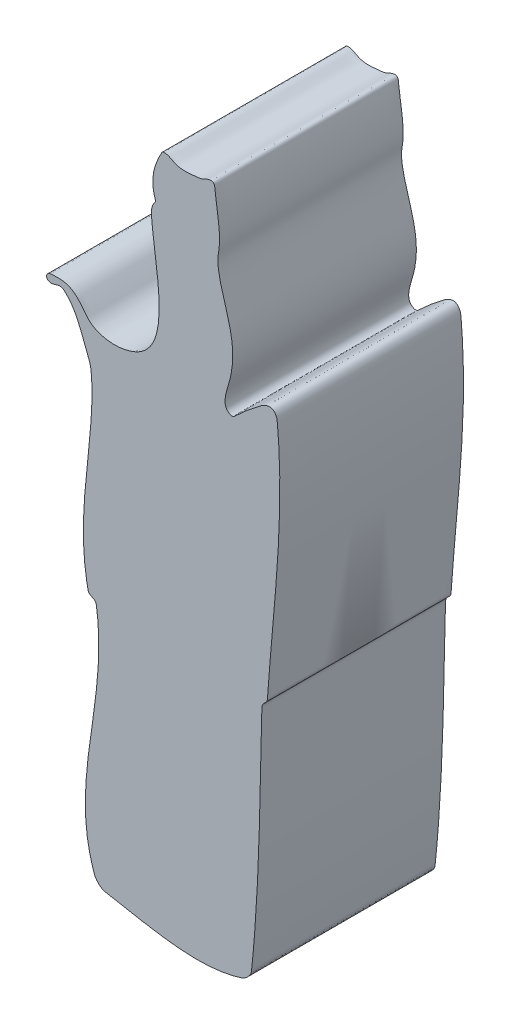
ISO-10303-21;
HEADER;
FILE_DESCRIPTION(('STEP AP214'),'2;1');
FILE_NAME('part.step','',(''),(''),'','','');
FILE_SCHEMA(('AUTOMOTIVE_DESIGN { 1 0 10303 214 1 1 1 1 }'));
ENDSEC;
DATA;
#1=APPLICATION_CONTEXT('core data for automotive mechanical design processes');
#2=APPLICATION_PROTOCOL_DEFINITION('international standard','automotive_design',2000,#1);
#3=PRODUCT_CONTEXT('',#1,'mechanical');
#4=PRODUCT('Part','Part','',(#3));
#5=PRODUCT_RELATED_PRODUCT_CATEGORY('part','',(#4));
#6=PRODUCT_DEFINITION_FORMATION('','',#4);
#7=PRODUCT_DEFINITION_CONTEXT('part definition',#1,'design');
#8=PRODUCT_DEFINITION('design','',#6,#7);
#9=PRODUCT_DEFINITION_SHAPE('','',#8);
#10=(LENGTH_UNIT() NAMED_UNIT(*) SI_UNIT(.MILLI.,.METRE.));
#11=(NAMED_UNIT(*) PLANE_ANGLE_UNIT() SI_UNIT($,.RADIAN.));
#12=(NAMED_UNIT(*) SI_UNIT($,.STERADIAN.) SOLID_ANGLE_UNIT());
#13=UNCERTAINTY_MEASURE_WITH_UNIT(LENGTH_MEASURE(1.E-05),#10,'distance_accuracy_value','');
#14=(GEOMETRIC_REPRESENTATION_CONTEXT(3) GLOBAL_UNCERTAINTY_ASSIGNED_CONTEXT((#13)) GLOBAL_UNIT_ASSIGNED_CONTEXT((#10,
#11,#12)) REPRESENTATION_CONTEXT('',''));
#15=CARTESIAN_POINT('',(0.,0.,0.));
#16=DIRECTION('',(0.,0.,1.));
#17=DIRECTION('',(1.,0.,0.));
#18=AXIS2_PLACEMENT_3D('',#15,#16,#17);
#19=CARTESIAN_POINT('',(-2.84327317577726,9.40057427969098,13.0312789324937));
#20=CARTESIAN_POINT('',(-2.87193279980725,9.38779134957365,13.0312789324937));
#21=CARTESIAN_POINT('',(-3.71609915452835,9.02774919943725,13.0312789324937));
#22=CARTESIAN_POINT('',(-4.9407177870403,8.96517316075776,13.0312789324937));
#23=CARTESIAN_POINT('',(-6.30181208482802,9.70596169329411,13.0312789324937));
#24=CARTESIAN_POINT('',(-6.72966835842915,10.5319496937223,13.0312789324937));
#25=CARTESIAN_POINT('',(-7.47567251158926,11.0711274566622,13.0312789324937));
#26=CARTESIAN_POINT('',(-8.10779076047364,11.228842935965,13.0312789324937));
#27=CARTESIAN_POINT('',(-8.59551212350109,11.1911792736558,13.0312789324937));
#28=CARTESIAN_POINT('',(-9.01006450051737,11.176950858307,13.0312789324937));
#29=CARTESIAN_POINT('',(-9.17123059684803,10.9740322998762,13.0312789324937));
#30=CARTESIAN_POINT('',(-9.14242667515833,10.7596767255446,13.0312789324937));
#31=CARTESIAN_POINT('',(-8.78754050872019,10.4841947376975,13.0312789324937));
#32=CARTESIAN_POINT('',(-8.2328316023407,10.9329700323297,13.0312789324937));
#33=CARTESIAN_POINT('',(-6.98413627033757,9.83568312479909,13.0312789324937));
#34=CARTESIAN_POINT('',(-6.64434610314443,8.42597210179692,13.0312789324937));
#35=CARTESIAN_POINT('',(-6.04749690772715,7.08186379426974,13.0312789324937));
#36=CARTESIAN_POINT('',(-5.90690459755383,5.93831708420874,13.0312789324937));
#37=CARTESIAN_POINT('',(-5.97688156229245,1.29951466216208,13.0312789324937));
#38=CARTESIAN_POINT('',(-7.0072490579731,-3.08079606873247,13.0312789324937));
#39=CARTESIAN_POINT('',(-6.15992285373959,-7.1872460288688,13.0312789324937));
#40=CARTESIAN_POINT('',(-5.66531078486117,-7.24733526784802,13.0312789324937));
#41=CARTESIAN_POINT('',(-4.73633444867842,-13.3269961059982,13.0312789324937));
#42=CARTESIAN_POINT('',(-7.61484589955967,-18.9069756105016,13.0312789324937));
#43=CARTESIAN_POINT('',(-5.70264939210548,-24.3307604578791,13.0312789324937));
#44=CARTESIAN_POINT('',(-5.47347706627157,-24.5985694718567,13.0312789324937));
#45=CARTESIAN_POINT('',(-5.18570457829271,-24.8304594175569,13.0312789324937));
#46=CARTESIAN_POINT('',(-1.83486199202435,-25.4187081058888,13.0312789324937));
#47=CARTESIAN_POINT('',(1.61585809002355,-26.2899160383829,13.0312789324937));
#48=CARTESIAN_POINT('',(4.86014796622657,-25.2551616029572,13.0312789324937));
#49=CARTESIAN_POINT('',(5.14444593349799,-25.0202594379908,13.0312789324937));
#50=CARTESIAN_POINT('',(5.37044021174562,-24.7251476686891,13.0312789324937));
#51=CARTESIAN_POINT('',(5.96205657647242,-18.9736801596678,13.0312789324937));
#52=CARTESIAN_POINT('',(5.97373282601918,-13.7443225093864,13.0312789324937));
#53=CARTESIAN_POINT('',(6.13050609811311,-7.69502489458681,13.0312789324937));
#54=CARTESIAN_POINT('',(6.50269031218164,-7.50397254304926,13.0312789324937));
#55=CARTESIAN_POINT('',(6.92461516765035,-1.24299564717522,13.0312789324937));
#56=CARTESIAN_POINT('',(7.77317789887139,4.38521835252585,13.0312789324937));
#57=CARTESIAN_POINT('',(7.19352828559257,10.3620016568231,13.0312789324937));
#58=CARTESIAN_POINT('',(7.03757640268812,10.6455887993252,13.0312789324937));
#59=CARTESIAN_POINT('',(6.7773627253225,10.8130922228654,13.0312789324937));
#60=CARTESIAN_POINT('',(6.3043831585843,10.7382767346321,13.0312789324937));
#61=CARTESIAN_POINT('',(5.47536561800035,10.095837228461,13.0312789324937));
#62=CARTESIAN_POINT('',(4.74462198897458,9.50170804072311,13.0312789324937));
#63=CARTESIAN_POINT('',(4.06654608337928,8.8359654194027,13.0312789324937));
#64=CARTESIAN_POINT('',(3.18266237596785,9.17494080000928,13.0312789324937));
#65=CARTESIAN_POINT('',(4.85948833771099,12.9856372583855,13.0312789324937));
#66=CARTESIAN_POINT('',(3.27238292973361,15.4286721541148,13.0312789324937));
#67=CARTESIAN_POINT('',(2.96289164531602,17.9890353502646,13.0312789324937));
#68=CARTESIAN_POINT('',(3.28291918298424,19.6534735245693,13.0312789324937));
#69=CARTESIAN_POINT('',(2.88682196445795,21.0776740321463,13.0312789324937));
#70=CARTESIAN_POINT('',(2.77394543743225,22.4688680605593,13.0312789324937));
#71=CARTESIAN_POINT('',(2.63367431586885,22.6223138334813,13.0312789324937));
#72=CARTESIAN_POINT('',(2.27716300990624,22.611675043943,13.0312789324937));
#73=CARTESIAN_POINT('',(1.92981097082666,22.3619320433464,13.0312789324937));
#74=CARTESIAN_POINT('',(1.09414177706618,22.2824698042369,13.0312789324937));
#75=CARTESIAN_POINT('',(0.145146934740726,22.1554516516977,13.0312789324937));
#76=CARTESIAN_POINT('',(-0.533357308613796,22.6981355715037,13.0312789324937));
#77=CARTESIAN_POINT('',(-0.936987808281571,22.6582268781377,13.0312789324937));
#78=CARTESIAN_POINT('',(-1.51765001445511,21.629028961127,13.0312789324937));
#79=CARTESIAN_POINT('',(-1.82949098949479,20.4909582401242,13.0312789324937));
#80=CARTESIAN_POINT('',(-1.39401097763185,19.3455157722467,13.0312789324937));
#81=CARTESIAN_POINT('',(-1.75497462318955,18.9514783539059,13.0312789324937));
#82=CARTESIAN_POINT('',(-1.55623366743635,15.4669785213429,13.0312789324937));
#83=CARTESIAN_POINT('',(-0.195519059957999,10.5815407778898,13.0312789324937));
#84=CARTESIAN_POINT('',(-2.84327317577726,9.40057427969098,13.0312789324937));
#85=B_SPLINE_CURVE_WITH_KNOTS('',3,(#19,#20,#21,#22,#23,#24,#25,#26,#27,#28,#29,#30,#31,#32,#33,
#34,#35,#36,#37,#38,#39,#40,#41,#42,#43,#44,#45,#46,#47,#48,#49,#50,#51,#52,#53,#54,#55,#56,#57,
#58,#59,#60,#61,#62,#63,#64,#65,#66,#67,#68,#69,#70,#71,#72,#73,#74,#75,#76,#77,#78,#79,#80,#81,
#82,#83,#84),.UNSPECIFIED.,.T.,.F.,(4,1,1,1,1,1,1,1,1,1,1,1,1,1,1,1,1,1,1,1,1,1,1,1,1,1,1,1,1,1,
1,1,1,1,1,1,1,1,1,1,1,1,1,1,1,1,1,1,1,1,1,1,1,1,1,1,1,1,1,1,1,1,1,4),(0.,0.000751600656848317,
0.0217953472729219,0.0254955043159888,0.0371657786956848,0.0427483589116183,0.0469323336600453,
0.0523035468373869,0.0545931240937758,0.0562846572825045,0.0577821144507112,0.0592475771225589,
0.0660542256414931,0.0693522567646764,0.095455417524012,0.100088358235942,0.104134458257981,
0.122683235143146,0.210114432510766,0.21229108587817,0.216576187351031,0.218929084451405,
0.348568024921781,0.351273021210487,0.354372011379793,0.356840807091248,0.359875310562864,
0.433913505382713,0.436732486703323,0.440099345753822,0.442542395544271,0.445333231681284,
0.574709127991864,0.57746469447173,0.580765598957534,0.583089875815042,0.71954605269884,
0.722222981318614,0.724628758722544,0.727040966457404,0.729003917732807,0.735559348884235,
0.75109030567781,0.754010879132209,0.755188858253221,0.771938182388344,0.821403739008364,
0.828989823395107,0.83198984014547,0.861550272822894,0.863290514376462,0.864487975221889,
0.866071637436777,0.871141050640973,0.874319723278609,0.885898538667408,0.892394389850456,
0.893586322304061,0.894728440582283,0.918897750565624,0.920215135823028,0.921364914957145,
0.930562462000871,1.),.UNSPECIFIED.);
#86=DIRECTION('',(0.,0.,-1.));
#87=VECTOR('',#86,1.);
#88=SURFACE_OF_LINEAR_EXTRUSION('',#85,#87);
#89=CARTESIAN_POINT('',(-2.84327317577726,9.40057427969098,13.0312789324937));
#90=VERTEX_POINT('',#89);
#91=EDGE_CURVE('E10',#90,#90,#85,.T.);
#92=ORIENTED_EDGE('',*,*,#91,.F.);
#93=EDGE_LOOP('',(#92));
#94=FACE_BOUND('',#93,.T.);
#95=CARTESIAN_POINT('',(-2.84327317577726,9.40057427969098,0.));
#96=CARTESIAN_POINT('',(-2.87193279980725,9.38779134957365,0.));
#97=CARTESIAN_POINT('',(-3.71609915452835,9.02774919943725,0.));
#98=CARTESIAN_POINT('',(-4.9407177870403,8.96517316075776,0.));
#99=CARTESIAN_POINT('',(-6.30181208482802,9.70596169329411,0.));
#100=CARTESIAN_POINT('',(-6.72966835842915,10.5319496937223,0.));
#101=CARTESIAN_POINT('',(-7.47567251158926,11.0711274566622,0.));
#102=CARTESIAN_POINT('',(-8.10779076047364,11.228842935965,0.));
#103=CARTESIAN_POINT('',(-8.59551212350109,11.1911792736558,0.));
#104=CARTESIAN_POINT('',(-9.01006450051737,11.176950858307,0.));
#105=CARTESIAN_POINT('',(-9.17123059684803,10.9740322998762,0.));
#106=CARTESIAN_POINT('',(-9.14242667515833,10.7596767255446,0.));
#107=CARTESIAN_POINT('',(-8.78754050872019,10.4841947376975,0.));
#108=CARTESIAN_POINT('',(-8.2328316023407,10.9329700323297,0.));
#109=CARTESIAN_POINT('',(-6.98413627033757,9.83568312479909,0.));
#110=CARTESIAN_POINT('',(-6.64434610314443,8.42597210179692,0.));
#111=CARTESIAN_POINT('',(-6.04749690772715,7.08186379426974,0.));
#112=CARTESIAN_POINT('',(-5.90690459755383,5.93831708420874,0.));
#113=CARTESIAN_POINT('',(-5.97688156229245,1.29951466216208,0.));
#114=CARTESIAN_POINT('',(-7.0072490579731,-3.08079606873247,0.));
#115=CARTESIAN_POINT('',(-6.15992285373959,-7.1872460288688,0.));
#116=CARTESIAN_POINT('',(-5.66531078486117,-7.24733526784802,0.));
#117=CARTESIAN_POINT('',(-4.73633444867842,-13.3269961059982,0.));
#118=CARTESIAN_POINT('',(-7.61484589955967,-18.9069756105016,0.));
#119=CARTESIAN_POINT('',(-5.70264939210548,-24.3307604578791,0.));
#120=CARTESIAN_POINT('',(-5.47347706627157,-24.5985694718567,0.));
#121=CARTESIAN_POINT('',(-5.18570457829271,-24.8304594175569,0.));
#122=CARTESIAN_POINT('',(-1.83486199202435,-25.4187081058888,0.));
#123=CARTESIAN_POINT('',(1.61585809002355,-26.2899160383829,0.));
#124=CARTESIAN_POINT('',(4.86014796622657,-25.2551616029572,0.));
#125=CARTESIAN_POINT('',(5.14444593349799,-25.0202594379908,0.));
#126=CARTESIAN_POINT('',(5.37044021174562,-24.7251476686891,0.));
#127=CARTESIAN_POINT('',(5.96205657647242,-18.9736801596678,0.));
#128=CARTESIAN_POINT('',(5.97373282601918,-13.7443225093864,0.));
#129=CARTESIAN_POINT('',(6.13050609811311,-7.69502489458681,0.));
#130=CARTESIAN_POINT('',(6.50269031218164,-7.50397254304926,0.));
#131=CARTESIAN_POINT('',(6.92461516765035,-1.24299564717522,0.));
#132=CARTESIAN_POINT('',(7.77317789887139,4.38521835252585,0.));
#133=CARTESIAN_POINT('',(7.19352828559257,10.3620016568231,0.));
#134=CARTESIAN_POINT('',(7.03757640268812,10.6455887993252,0.));
#135=CARTESIAN_POINT('',(6.7773627253225,10.8130922228654,0.));
#136=CARTESIAN_POINT('',(6.3043831585843,10.7382767346321,0.));
#137=CARTESIAN_POINT('',(5.47536561800035,10.095837228461,0.));
#138=CARTESIAN_POINT('',(4.74462198897458,9.50170804072311,0.));
#139=CARTESIAN_POINT('',(4.06654608337928,8.8359654194027,0.));
#140=CARTESIAN_POINT('',(3.18266237596785,9.17494080000928,0.));
#141=CARTESIAN_POINT('',(4.85948833771099,12.9856372583855,0.));
#142=CARTESIAN_POINT('',(3.27238292973361,15.4286721541148,0.));
#143=CARTESIAN_POINT('',(2.96289164531602,17.9890353502646,0.));
#144=CARTESIAN_POINT('',(3.28291918298424,19.6534735245693,0.));
#145=CARTESIAN_POINT('',(2.88682196445795,21.0776740321463,0.));
#146=CARTESIAN_POINT('',(2.77394543743225,22.4688680605593,0.));
#147=CARTESIAN_POINT('',(2.63367431586885,22.6223138334813,0.));
#148=CARTESIAN_POINT('',(2.27716300990624,22.611675043943,0.));
#149=CARTESIAN_POINT('',(1.92981097082666,22.3619320433464,0.));
#150=CARTESIAN_POINT('',(1.09414177706618,22.2824698042369,0.));
#151=CARTESIAN_POINT('',(0.145146934740726,22.1554516516977,0.));
#152=CARTESIAN_POINT('',(-0.533357308613796,22.6981355715037,0.));
#153=CARTESIAN_POINT('',(-0.936987808281571,22.6582268781377,0.));
#154=CARTESIAN_POINT('',(-1.51765001445511,21.629028961127,0.));
#155=CARTESIAN_POINT('',(-1.82949098949479,20.4909582401242,0.));
#156=CARTESIAN_POINT('',(-1.39401097763185,19.3455157722467,0.));
#157=CARTESIAN_POINT('',(-1.75497462318955,18.9514783539059,0.));
#158=CARTESIAN_POINT('',(-1.55623366743635,15.4669785213429,0.));
#159=CARTESIAN_POINT('',(-0.195519059957999,10.5815407778898,0.));
#160=CARTESIAN_POINT('',(-2.84327317577726,9.40057427969098,0.));
#161=B_SPLINE_CURVE_WITH_KNOTS('',3,(#95,#96,#97,#98,#99,#100,#101,#102,#103,#104,#105,#106,
#107,#108,#109,#110,#111,#112,#113,#114,#115,#116,#117,#118,#119,#120,#121,#122,#123,#124,#125,
#126,#127,#128,#129,#130,#131,#132,#133,#134,#135,#136,#137,#138,#139,#140,#141,#142,#143,#144,
#145,#146,#147,#148,#149,#150,#151,#152,#153,#154,#155,#156,#157,#158,#159,#160),.UNSPECIFIED.,
.T.,.F.,(4,1,1,1,1,1,1,1,1,1,1,1,1,1,1,1,1,1,1,1,1,1,1,1,1,1,1,1,1,1,1,1,1,1,1,1,1,1,1,1,1,1,1,
1,1,1,1,1,1,1,1,1,1,1,1,1,1,1,1,1,1,1,1,4),(0.,0.000751600656848317,0.0217953472729219,
0.0254955043159888,0.0371657786956848,0.0427483589116183,0.0469323336600453,0.0523035468373869,
0.0545931240937758,0.0562846572825045,0.0577821144507112,0.0592475771225589,0.0660542256414931,
0.0693522567646764,0.095455417524012,0.100088358235942,0.104134458257981,0.122683235143146,
0.210114432510766,0.21229108587817,0.216576187351031,0.218929084451405,0.348568024921781,
0.351273021210487,0.354372011379793,0.356840807091248,0.359875310562864,0.433913505382713,
0.436732486703323,0.440099345753822,0.442542395544271,0.445333231681284,0.574709127991864,
0.57746469447173,0.580765598957534,0.583089875815042,0.71954605269884,0.722222981318614,
0.724628758722544,0.727040966457404,0.729003917732807,0.735559348884235,0.75109030567781,
0.754010879132209,0.755188858253221,0.771938182388344,0.821403739008364,0.828989823395107,
0.83198984014547,0.861550272822894,0.863290514376462,0.864487975221889,0.866071637436777,
0.871141050640973,0.874319723278609,0.885898538667408,0.892394389850456,0.893586322304061,
0.894728440582283,0.918897750565624,0.920215135823028,0.921364914957145,0.930562462000871,1.),.UNSPECIFIED.);
#162=CARTESIAN_POINT('',(-2.84327317577726,9.40057427969098,0.));
#163=VERTEX_POINT('',#162);
#164=EDGE_CURVE('E41',#163,#163,#161,.T.);
#165=ORIENTED_EDGE('',*,*,#164,.T.);
#166=EDGE_LOOP('',(#165));
#167=FACE_BOUND('',#166,.T.);
#168=ADVANCED_FACE('F37',(#94,#167),#88,.F.);
#169=CARTESIAN_POINT('',(5.87046170594684,-17.5638465582779,13.0312789324937));
#170=DIRECTION('',(0.,0.,-1.));
#171=DIRECTION('',(-1.,0.,0.));
#172=AXIS2_PLACEMENT_3D('',#169,#170,#171);
#173=PLANE('',#172);
#174=ORIENTED_EDGE('',*,*,#91,.T.);
#175=EDGE_LOOP('',(#174));
#176=FACE_BOUND('',#175,.T.);
#177=ADVANCED_FACE('F60',(#176),#173,.F.);
#178=CARTESIAN_POINT('',(5.87046170594684,-17.5638465582779,0.));
#179=DIRECTION('',(0.,0.,-1.));
#180=DIRECTION('',(-1.,0.,0.));
#181=AXIS2_PLACEMENT_3D('',#178,#179,#180);
#182=PLANE('',#181);
#183=ORIENTED_EDGE('',*,*,#164,.F.);
#184=EDGE_LOOP('',(#183));
#185=FACE_BOUND('',#184,.T.);
#186=ADVANCED_FACE('F58',(#185),#182,.T.);
#187=CLOSED_SHELL('',(#168,#177,#186));
#188=MANIFOLD_SOLID_BREP('B2',#187);
#189=ADVANCED_BREP_SHAPE_REPRESENTATION('',(#18,#188),#14);
#190=SHAPE_DEFINITION_REPRESENTATION(#9,#189);
ENDSEC;
END-ISO-10303-21;
